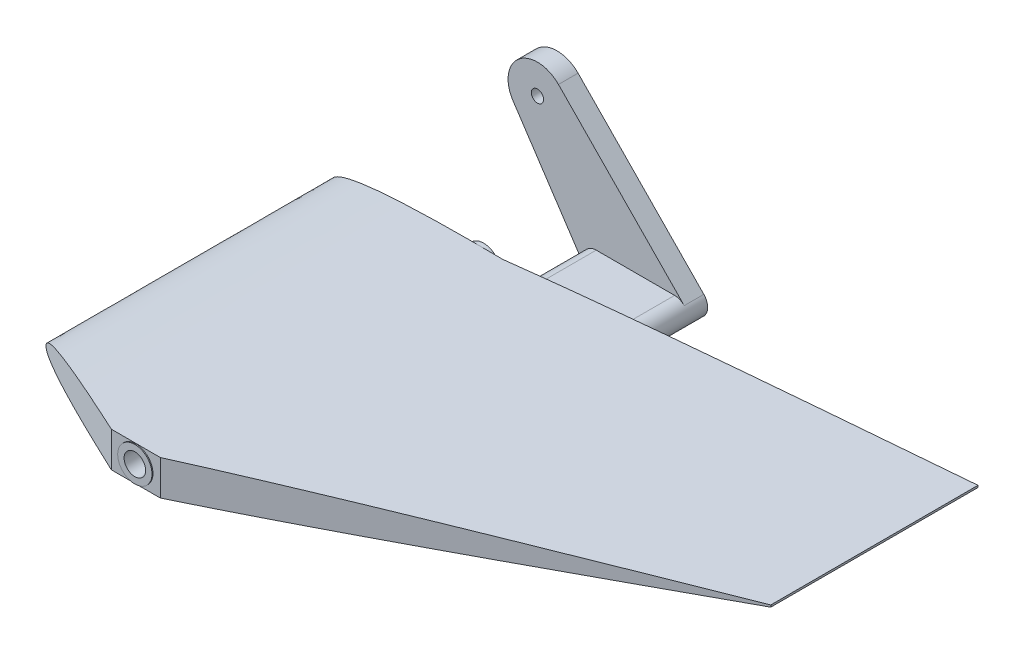
ISO-10303-21;
HEADER;
FILE_DESCRIPTION(('STEP AP214'),'2;1');
FILE_NAME('part.step','',(''),(''),'','','');
FILE_SCHEMA(('AUTOMOTIVE_DESIGN { 1 0 10303 214 1 1 1 1 }'));
ENDSEC;
DATA;
#1=APPLICATION_CONTEXT('core data for automotive mechanical design processes');
#2=APPLICATION_PROTOCOL_DEFINITION('international standard','automotive_design',2000,#1);
#3=PRODUCT_CONTEXT('',#1,'mechanical');
#4=PRODUCT('Part','Part','',(#3));
#5=PRODUCT_RELATED_PRODUCT_CATEGORY('part','',(#4));
#6=PRODUCT_DEFINITION_FORMATION('','',#4);
#7=PRODUCT_DEFINITION_CONTEXT('part definition',#1,'design');
#8=PRODUCT_DEFINITION('design','',#6,#7);
#9=PRODUCT_DEFINITION_SHAPE('','',#8);
#10=(LENGTH_UNIT() NAMED_UNIT(*) SI_UNIT(.MILLI.,.METRE.));
#11=(NAMED_UNIT(*) PLANE_ANGLE_UNIT() SI_UNIT($,.RADIAN.));
#12=(NAMED_UNIT(*) SI_UNIT($,.STERADIAN.) SOLID_ANGLE_UNIT());
#13=UNCERTAINTY_MEASURE_WITH_UNIT(LENGTH_MEASURE(1.E-05),#10,'distance_accuracy_value','');
#14=(GEOMETRIC_REPRESENTATION_CONTEXT(3) GLOBAL_UNCERTAINTY_ASSIGNED_CONTEXT((#13)) GLOBAL_UNIT_ASSIGNED_CONTEXT((#10,
#11,#12)) REPRESENTATION_CONTEXT('',''));
#15=CARTESIAN_POINT('',(0.,0.,0.));
#16=DIRECTION('',(0.,0.,1.));
#17=DIRECTION('',(1.,0.,0.));
#18=AXIS2_PLACEMENT_3D('',#15,#16,#17);
#19=CARTESIAN_POINT('',(-2.5,-1.96626552457139,15.));
#20=DIRECTION('',(0.,0.,1.));
#21=DIRECTION('',(1.,0.,0.));
#22=AXIS2_PLACEMENT_3D('',#19,#20,#21);
#23=PLANE('',#22);
#24=CARTESIAN_POINT('',(-15.,0.,15.));
#25=CARTESIAN_POINT('',(-15.,3.23099592693577,15.));
#26=CARTESIAN_POINT('',(19.0770662568638,1.403070244414,15.));
#27=CARTESIAN_POINT('',(44.9999166666089,0.100000000000006,15.));
#28=B_SPLINE_CURVE_WITH_KNOTS('',3,(#24,#25,#26,#27),.UNSPECIFIED.,.F.,.F.,(4,4),(0.,1.),.UNSPECIFIED.);
#29=CARTESIAN_POINT('',(-15.,0.,15.));
#30=VERTEX_POINT('',#29);
#31=CARTESIAN_POINT('',(2.5,1.79110454395852,15.));
#32=VERTEX_POINT('',#31);
#33=EDGE_CURVE('E220',#30,#32,#28,.T.);
#34=ORIENTED_EDGE('',*,*,#33,.T.);
#35=DIRECTION('',(0.,1.,0.));
#36=VECTOR('',#35,1.);
#37=CARTESIAN_POINT('',(2.5,-1.96626552457139,15.));
#38=LINE('',#37,#36);
#39=CARTESIAN_POINT('',(2.49999999900894,-1.79110454395852,15.));
#40=VERTEX_POINT('',#39);
#41=EDGE_CURVE('E215',#40,#32,#38,.T.);
#42=ORIENTED_EDGE('',*,*,#41,.F.);
#43=CARTESIAN_POINT('',(-15.,0.,15.));
#44=CARTESIAN_POINT('',(-15.,-3.23099592693578,15.));
#45=CARTESIAN_POINT('',(19.0770662568638,-1.40307024441399,15.));
#46=CARTESIAN_POINT('',(44.9999166666089,-0.0999999999999841,15.));
#47=B_SPLINE_CURVE_WITH_KNOTS('',3,(#43,#44,#45,#46),.UNSPECIFIED.,.F.,.F.,(4,4),(0.,1.),.UNSPECIFIED.);
#48=EDGE_CURVE('E261',#30,#40,#47,.T.);
#49=ORIENTED_EDGE('',*,*,#48,.F.);
#50=EDGE_LOOP('',(#34,#42,#49));
#51=FACE_BOUND('',#50,.T.);
#52=CARTESIAN_POINT('',(0.,0.,15.));
#53=DIRECTION('',(0.,0.,1.));
#54=DIRECTION('',(1.,0.,0.));
#55=AXIS2_PLACEMENT_3D('',#52,#53,#54);
#56=CIRCLE('',#55,1.75);
#57=CARTESIAN_POINT('',(1.75,0.,15.));
#58=VERTEX_POINT('',#57);
#59=EDGE_CURVE('E11',#58,#58,#56,.F.);
#60=ORIENTED_EDGE('',*,*,#59,.F.);
#61=EDGE_LOOP('',(#60));
#62=FACE_BOUND('',#61,.T.);
#63=ADVANCED_FACE('F32',(#51,#62),#23,.F.);
#64=CARTESIAN_POINT('',(5.27888942965003,1.75027481425616,50.));
#65=DIRECTION('',(0.,0.,1.));
#66=DIRECTION('',(1.,0.,0.));
#67=AXIS2_PLACEMENT_3D('',#64,#65,#66);
#68=PLANE('',#67);
#69=DIRECTION('',(0.,1.,0.));
#70=VECTOR('',#69,1.);
#71=CARTESIAN_POINT('',(-2.5,-1.96626552457139,50.));
#72=LINE('',#71,#70);
#73=CARTESIAN_POINT('',(-2.5,-1.79873151539779,50.));
#74=VERTEX_POINT('',#73);
#75=CARTESIAN_POINT('',(-2.5,1.79873151539779,50.));
#76=VERTEX_POINT('',#75);
#77=EDGE_CURVE('E237',#74,#76,#72,.T.);
#78=ORIENTED_EDGE('',*,*,#77,.F.);
#79=CARTESIAN_POINT('',(-15.,0.,50.));
#80=CARTESIAN_POINT('',(-15.,-3.23099592693578,50.));
#81=CARTESIAN_POINT('',(19.0770662568638,-1.40307024441399,50.));
#82=CARTESIAN_POINT('',(44.9999166666089,-0.0999999999999841,50.));
#83=B_SPLINE_CURVE_WITH_KNOTS('',3,(#79,#80,#81,#82),.UNSPECIFIED.,.F.,.F.,(4,4),(0.,1.),.UNSPECIFIED.);
#84=CARTESIAN_POINT('',(2.49999999897597,-1.79110454395887,50.));
#85=VERTEX_POINT('',#84);
#86=EDGE_CURVE('E277',#74,#85,#83,.T.);
#87=ORIENTED_EDGE('',*,*,#86,.T.);
#88=DIRECTION('',(0.,1.,0.));
#89=VECTOR('',#88,1.);
#90=CARTESIAN_POINT('',(2.5,-1.96626552457139,50.));
#91=LINE('',#90,#89);
#92=CARTESIAN_POINT('',(2.5,1.79110454395852,50.));
#93=VERTEX_POINT('',#92);
#94=EDGE_CURVE('E236',#85,#93,#91,.T.);
#95=ORIENTED_EDGE('',*,*,#94,.T.);
#96=CARTESIAN_POINT('',(-15.,0.,50.));
#97=CARTESIAN_POINT('',(-15.,3.23099592693577,50.));
#98=CARTESIAN_POINT('',(19.0770662568638,1.403070244414,50.));
#99=CARTESIAN_POINT('',(44.9999166666089,0.100000000000006,50.));
#100=B_SPLINE_CURVE_WITH_KNOTS('',3,(#96,#97,#98,#99),.UNSPECIFIED.,.F.,.F.,(4,4),(0.,1.),.UNSPECIFIED.);
#101=EDGE_CURVE('E294',#76,#93,#100,.T.);
#102=ORIENTED_EDGE('',*,*,#101,.F.);
#103=EDGE_LOOP('',(#78,#87,#95,#102));
#104=FACE_BOUND('',#103,.T.);
#105=CARTESIAN_POINT('',(0.,0.,50.));
#106=DIRECTION('',(0.,0.,1.));
#107=DIRECTION('',(1.,0.,0.));
#108=AXIS2_PLACEMENT_3D('',#105,#106,#107);
#109=CIRCLE('',#108,1.75);
#110=CARTESIAN_POINT('',(1.75,0.,50.));
#111=VERTEX_POINT('',#110);
#112=EDGE_CURVE('E211',#111,#111,#109,.T.);
#113=ORIENTED_EDGE('',*,*,#112,.F.);
#114=EDGE_LOOP('',(#113));
#115=FACE_BOUND('',#114,.T.);
#116=ADVANCED_FACE('F273',(#104,#115),#68,.T.);
#117=CARTESIAN_POINT('',(44.9999166666088,0.,50.));
#118=DIRECTION('',(-1.,0.,0.));
#119=DIRECTION('',(0.,0.,1.));
#120=AXIS2_PLACEMENT_3D('',#117,#118,#119);
#121=PLANE('',#120);
#122=DIRECTION('',(0.,0.,-1.));
#123=VECTOR('',#122,1.);
#124=CARTESIAN_POINT('',(44.9999166666089,-0.0999999999999841,50.));
#125=LINE('',#124,#123);
#126=CARTESIAN_POINT('',(44.9999166666089,-0.0999999999999841,30.1819633874109));
#127=VERTEX_POINT('',#126);
#128=CARTESIAN_POINT('',(44.9999166666089,-0.0999999999999841,9.027026236893));
#129=VERTEX_POINT('',#128);
#130=EDGE_CURVE('E284',#127,#129,#125,.T.);
#131=ORIENTED_EDGE('',*,*,#130,.T.);
#132=DIRECTION('',(0.,1.,0.));
#133=VECTOR('',#132,1.);
#134=CARTESIAN_POINT('',(44.9999166666088,0.,9.02702623689302));
#135=LINE('',#134,#133);
#136=CARTESIAN_POINT('',(44.9999166666088,0.100000000000006,9.02702623689302));
#137=VERTEX_POINT('',#136);
#138=EDGE_CURVE('E224',#129,#137,#135,.T.);
#139=ORIENTED_EDGE('',*,*,#138,.T.);
#140=DIRECTION('',(0.,0.,-1.));
#141=VECTOR('',#140,1.);
#142=CARTESIAN_POINT('',(44.9999166666089,0.100000000000006,50.));
#143=LINE('',#142,#141);
#144=CARTESIAN_POINT('',(44.9999166666088,0.100000000000006,30.181963387411));
#145=VERTEX_POINT('',#144);
#146=EDGE_CURVE('E306',#145,#137,#143,.T.);
#147=ORIENTED_EDGE('',*,*,#146,.F.);
#148=DIRECTION('',(0.,-1.,0.));
#149=VECTOR('',#148,1.);
#150=CARTESIAN_POINT('',(44.9999166666088,0.,30.181963387411));
#151=LINE('',#150,#149);
#152=EDGE_CURVE('E431',#145,#127,#151,.T.);
#153=ORIENTED_EDGE('',*,*,#152,.T.);
#154=EDGE_LOOP('',(#131,#139,#147,#153));
#155=FACE_BOUND('',#154,.T.);
#156=ADVANCED_FACE('F34',(#155),#121,.F.);
#157=DIRECTION('',(0.,0.,-1.));
#158=VECTOR('',#157,1.);
#159=SURFACE_OF_LINEAR_EXTRUSION('',#100,#158);
#160=CARTESIAN_POINT('',(2.49999999999999,1.7911045439479,15.));
#161=CARTESIAN_POINT('',(2.94299579855159,1.78635267424155,14.9377410007019));
#162=CARTESIAN_POINT('',(3.38598117579314,1.78069828541525,14.8754834660234));
#163=CARTESIAN_POINT('',(4.27192745899822,1.76776375571893,14.7509718358803));
#164=CARTESIAN_POINT('',(4.71488836502989,1.76048361963034,14.6887177404061));
#165=CARTESIAN_POINT('',(6.04368429824583,1.73647434461113,14.5019676508028));
#166=CARTESIAN_POINT('',(6.92948108974018,1.71757577885995,14.3774770303495));
#167=CARTESIAN_POINT('',(8.70094356229643,1.6750679631911,14.1285142158125));
#168=CARTESIAN_POINT('',(9.5866092456362,1.65145880798633,14.0040420214087));
#169=CARTESIAN_POINT('',(11.3578267455314,1.60033175807395,13.7551136355339));
#170=CARTESIAN_POINT('',(12.2433785623941,1.57281387414023,13.6306574440198));
#171=CARTESIAN_POINT('',(14.0143110058578,1.51450090959102,13.3817691202139));
#172=CARTESIAN_POINT('',(14.8996916402329,1.48370606806087,13.2573369868295));
#173=CARTESIAN_POINT('',(16.6703624407205,1.41934297357888,13.0084854345458));
#174=CARTESIAN_POINT('',(17.5556526058426,1.38577469296889,12.8840660157858));
#175=CARTESIAN_POINT('',(19.3261482209496,1.31628286701933,12.6352390842017));
#176=CARTESIAN_POINT('',(20.2113536702905,1.28035930501083,12.5108315714682));
#177=CARTESIAN_POINT('',(21.9816831062746,1.20651125141132,12.2620279948368));
#178=CARTESIAN_POINT('',(22.8668070928595,1.16858675840047,12.1376319309471));
#179=CARTESIAN_POINT('',(24.6373891638133,1.09102641281829,11.8887928487862));
#180=CARTESIAN_POINT('',(25.5228472146365,1.05138978126176,11.7643498352295));
#181=CARTESIAN_POINT('',(27.293695305898,0.97069538162099,11.5154733663525));
#182=CARTESIAN_POINT('',(28.1790853466496,0.92963762053659,11.3910399109881));
#183=CARTESIAN_POINT('',(29.9498094008223,0.846350598441158,11.1421808743871));
#184=CARTESIAN_POINT('',(30.8351434143586,0.80412133992343,11.0177552931343));
#185=CARTESIAN_POINT('',(32.605766665088,0.718725360707533,10.7689104235333));
#186=CARTESIAN_POINT('',(33.4910559022991,0.675558640389358,10.6444911351826));
#187=CARTESIAN_POINT('',(35.2616654709427,0.588510229476522,10.3956481884734));
#188=CARTESIAN_POINT('',(36.1469857998332,0.544628486244644,10.2712245304722));
#189=CARTESIAN_POINT('',(37.9176034032698,0.456378321402104,10.0223804545465));
#190=CARTESIAN_POINT('',(38.8029006777951,0.412009899367418,9.89796003662492));
#191=CARTESIAN_POINT('',(40.5734832654907,0.323016223055397,9.64912088184067));
#192=CARTESIAN_POINT('',(41.4587685786507,0.278390968569554,9.5247021449794));
#193=CARTESIAN_POINT('',(43.2293394452683,0.18913586645454,9.27586463748525));
#194=CARTESIAN_POINT('',(44.1146249987257,0.144506018822963,9.15144586685238));
#195=CARTESIAN_POINT('',(44.9999166666089,0.100000000000006,9.027026236893));
#196=B_SPLINE_CURVE_WITH_KNOTS('',3,(#160,#161,#162,#163,#164,#165,#166,#167,#168,#169,#170,
#171,#172,#173,#174,#175,#176,#177,#178,#179,#180,#181,#182,#183,#184,#185,#186,#187,#188,#189,
#190,#191,#192,#193,#194,#195),.UNSPECIFIED.,.F.,.F.,(4,2,2,2,2,2,2,2,2,2,2,2,2,2,2,2,2,4),(0.,
1.34212144374541,2.68423894027807,5.36832684792177,8.05236079370445,10.7363873414423,
13.4202181978991,16.1040758221215,18.7879524427429,21.4718309678311,24.1569437322115,
26.8420432728096,29.5271370991374,32.2122298371015,34.8975211423197,37.5828147873192,
40.2681106126732,42.953407851464),.UNSPECIFIED.);
#197=EDGE_CURVE('E230',#32,#137,#196,.T.);
#198=ORIENTED_EDGE('',*,*,#197,.F.);
#199=ORIENTED_EDGE('',*,*,#33,.F.);
#200=DIRECTION('',(0.,0.,-1.));
#201=VECTOR('',#200,1.);
#202=CARTESIAN_POINT('',(-15.,0.,50.));
#203=LINE('',#202,#201);
#204=CARTESIAN_POINT('',(-15.,0.,44.1711542730625));
#205=VERTEX_POINT('',#204);
#206=EDGE_CURVE('E300',#205,#30,#203,.T.);
#207=ORIENTED_EDGE('',*,*,#206,.F.);
#208=CARTESIAN_POINT('',(-2.5000000004362,1.79873151545333,49.9999999999083));
#209=CARTESIAN_POINT('',(-2.84515491322294,1.79546444971144,49.8390516207544));
#210=CARTESIAN_POINT('',(-3.19030425147759,1.79128047791813,49.6781058410898));
#211=CARTESIAN_POINT('',(-3.8805847312388,1.78076039971026,49.3562227670807));
#212=CARTESIAN_POINT('',(-4.22571587203465,1.7744242370886,49.1952854730677));
#213=CARTESIAN_POINT('',(-4.91601959597944,1.75927973349909,48.8733915601451));
#214=CARTESIAN_POINT('',(-5.26119216850366,1.75047078603802,48.7124349461899));
#215=CARTESIAN_POINT('',(-5.95146253084114,1.72994671979295,48.390556590033));
#216=CARTESIAN_POINT('',(-6.29656032140354,1.71823163160998,48.2296348474819));
#217=CARTESIAN_POINT('',(-7.10552456244788,1.68672521632243,47.8524086267099));
#218=CARTESIAN_POINT('',(-7.56934902752301,1.66554197444838,47.6361237266055));
#219=CARTESIAN_POINT('',(-8.26479798707314,1.62761507467177,47.3118305509112));
#220=CARTESIAN_POINT('',(-8.49656083696065,1.61394783381314,47.2037577591329));
#221=CARTESIAN_POINT('',(-8.9599584417045,1.58419750997756,46.9876719072702));
#222=CARTESIAN_POINT('',(-9.1915931975437,1.56811444580258,46.8796588467275));
#223=CARTESIAN_POINT('',(-9.73545600741656,1.52697295832361,46.6260514534981));
#224=CARTESIAN_POINT('',(-10.0476123715414,1.50074066323682,46.4804905503648));
#225=CARTESIAN_POINT('',(-10.6714141885367,1.44148239591281,46.1896069859289));
#226=CARTESIAN_POINT('',(-10.9830596390394,1.40845639227933,46.0442843257303));
#227=CARTESIAN_POINT('',(-11.5050260467172,1.34511592780276,45.8008873925305));
#228=CARTESIAN_POINT('',(-11.7156007857884,1.31736382435564,45.7026947790876));
#229=CARTESIAN_POINT('',(-12.136066618857,1.2561678408189,45.5066283411352));
#230=CARTESIAN_POINT('',(-12.3459577830276,1.22272456502063,45.4087544839034));
#231=CARTESIAN_POINT('',(-12.6979466481651,1.15983938787114,45.2446193805045));
#232=CARTESIAN_POINT('',(-12.8403532114247,1.13251338436539,45.178214109485));
#233=CARTESIAN_POINT('',(-13.1243839136272,1.07304659107225,45.0457684178968));
#234=CARTESIAN_POINT('',(-13.2660079175113,1.04090499553157,44.9797280603071));
#235=CARTESIAN_POINT('',(-13.503931842671,0.981027670155204,44.8687823119469));
#236=CARTESIAN_POINT('',(-13.6005921474296,0.955044095776345,44.8237088715983));
#237=CARTESIAN_POINT('',(-13.7928763130635,0.898974348051597,44.7340452926213));
#238=CARTESIAN_POINT('',(-13.8885008983038,0.868891272792251,44.6894548162159));
#239=CARTESIAN_POINT('',(-14.0494000827992,0.813038693947245,44.6144262942947));
#240=CARTESIAN_POINT('',(-14.1150880805001,0.788725814487778,44.5837954779179));
#241=CARTESIAN_POINT('',(-14.2454364305391,0.736462795311037,44.5230130440669));
#242=CARTESIAN_POINT('',(-14.3100945807146,0.708505797889061,44.4928624534779));
#243=CARTESIAN_POINT('',(-14.4079896297293,0.661773492818289,44.4472132424269));
#244=CARTESIAN_POINT('',(-14.4419094032226,0.644742795960359,44.4313961922841));
#245=CARTESIAN_POINT('',(-14.5089935460627,0.608965819875951,44.400114342737));
#246=CARTESIAN_POINT('',(-14.5421581239068,0.590220021512818,44.3846494461088));
#247=CARTESIAN_POINT('',(-14.6073539391702,0.550674702175321,44.3542481381718));
#248=CARTESIAN_POINT('',(-14.6393881133792,0.529881132061422,44.3393103574155));
#249=CARTESIAN_POINT('',(-14.7019281835817,0.485687150431328,44.3101474437385));
#250=CARTESIAN_POINT('',(-14.7324355853007,0.462289383703129,44.2959216086865));
#251=CARTESIAN_POINT('',(-14.7857121781122,0.416816100397387,44.2710783254581));
#252=CARTESIAN_POINT('',(-14.8088679267476,0.395298604306648,44.2602806225392));
#253=CARTESIAN_POINT('',(-14.8529799547397,0.349554011757961,44.2397108460697));
#254=CARTESIAN_POINT('',(-14.8739329518419,0.325322979854669,44.2299403030596));
#255=CARTESIAN_POINT('',(-14.9128071651853,0.273306292004445,44.2118129596728));
#256=CARTESIAN_POINT('',(-14.9306727627901,0.245468663237339,44.2034820946922));
#257=CARTESIAN_POINT('',(-14.9611286892651,0.18655205842536,44.1892802629407));
#258=CARTESIAN_POINT('',(-14.9737507532035,0.155494046792322,44.1833944978645));
#259=CARTESIAN_POINT('',(-14.988485062429,0.103419653037316,44.176523776635));
#260=CARTESIAN_POINT('',(-14.99277291021,0.0831448335721506,44.1745243203777));
#261=CARTESIAN_POINT('',(-14.9985643505244,0.0419250654233688,44.1718237274074));
#262=CARTESIAN_POINT('',(-15.000041501236,0.020975620037573,44.1711349207184));
#263=CARTESIAN_POINT('',(-15.,0.,44.1711542730625));
#264=B_SPLINE_CURVE_WITH_KNOTS('',3,(#208,#209,#210,#211,#212,#213,#214,#215,#216,#217,#218,
#219,#220,#221,#222,#223,#224,#225,#226,#227,#228,#229,#230,#231,#232,#233,#234,#235,#236,#237,
#238,#239,#240,#241,#242,#243,#244,#245,#246,#247,#248,#249,#250,#251,#252,#253,#254,#255,#256,
#257,#258,#259,#260,#261,#262,#263),.UNSPECIFIED.,.F.,.F.,(4,2,2,2,2,2,2,2,2,2,2,2,2,2,2,2,2,2,
2,2,2,2,2,2,2,2,2,4),(0.,1.14255232233199,2.28513448611623,3.42799713314855,4.5708477465908,
6.10742476928897,6.87567670550753,7.64392266285183,8.68014812168788,9.7163783694152,
10.4183174070165,11.1201819588534,11.5985929535045,12.0770840863039,12.4063473299151,
12.7353631076222,12.9646459961354,13.1943667653768,13.3176908077183,13.4409803790147,
13.5639216863358,13.6867392561384,13.7868046537219,13.8870171031977,13.9888800914784,
14.0901172694087,14.152348844648,14.2151630277025),.UNSPECIFIED.);
#265=EDGE_CURVE('E285',#76,#205,#264,.T.);
#266=ORIENTED_EDGE('',*,*,#265,.F.);
#267=ORIENTED_EDGE('',*,*,#101,.T.);
#268=CARTESIAN_POINT('',(44.9999166666089,0.100000000000006,30.1819633874109));
#269=CARTESIAN_POINT('',(44.1148539520676,0.144494505529035,30.594674909149));
#270=CARTESIAN_POINT('',(43.2297963586757,0.189112829893827,31.0073840428559));
#271=CARTESIAN_POINT('',(41.4596813791523,0.278344955505571,31.8328022136225));
#272=CARTESIAN_POINT('',(40.5746239930207,0.322958756754525,32.2455112506823));
#273=CARTESIAN_POINT('',(38.8044992099027,0.411929685004527,33.0709339929402));
#274=CARTESIAN_POINT('',(37.9194318129235,0.456286812180722,33.4836476981349));
#275=CARTESIAN_POINT('',(36.1492777185011,0.54451463119046,34.3090841084785));
#276=CARTESIAN_POINT('',(35.2641910210724,0.588385323379482,34.7218068136206));
#277=CARTESIAN_POINT('',(33.4940436627264,0.675412493871967,35.5472400828802));
#278=CARTESIAN_POINT('',(32.6089830035915,0.718569016242302,35.9599506461665));
#279=CARTESIAN_POINT('',(30.838824195479,0.803945036408509,36.7853892545399));
#280=CARTESIAN_POINT('',(29.9537260464886,0.846164533885258,37.1981172996329));
#281=CARTESIAN_POINT('',(28.1834828393485,0.929432616607342,38.0235952639192));
#282=CARTESIAN_POINT('',(27.2983377811179,0.970481199763388,38.4363451831502));
#283=CARTESIAN_POINT('',(25.5279907251362,1.05115801918676,39.2618715729467));
#284=CARTESIAN_POINT('',(24.6427887271653,1.09078624959195,39.6746480436146));
#285=CARTESIAN_POINT('',(22.8721667258692,1.16835559329362,40.5003026425167));
#286=CARTESIAN_POINT('',(21.9867467117123,1.20629640632479,40.9131807758018));
#287=CARTESIAN_POINT('',(20.2158383976516,1.28017582945892,41.7389688845387));
#288=CARTESIAN_POINT('',(19.3303500977886,1.31611444075027,42.1518788599714));
#289=CARTESIAN_POINT('',(17.5593024862227,1.38563492380329,42.9777319242017));
#290=CARTESIAN_POINT('',(16.673743174972,1.41921680954154,43.3906750127884));
#291=CARTESIAN_POINT('',(14.9025487194378,1.48360547982689,44.2165965514857));
#292=CARTESIAN_POINT('',(14.01691357585,1.51441228756536,44.6295750012719));
#293=CARTESIAN_POINT('',(12.2454998028185,1.57274694526465,45.4555988093977));
#294=CARTESIAN_POINT('',(11.3597211679137,1.6002745947326,45.8686441702839));
#295=CARTESIAN_POINT('',(9.5880684633916,1.65141916297327,46.6947793939935));
#296=CARTESIAN_POINT('',(8.70219439355857,1.67503607271203,47.1078692569176));
#297=CARTESIAN_POINT('',(6.93033637435116,1.7175571317118,47.9341002204374));
#298=CARTESIAN_POINT('',(6.04435242337699,1.73646120156521,48.3472413217791));
#299=CARTESIAN_POINT('',(4.7152920668592,1.76047685957017,48.9669923441735));
#300=CARTESIAN_POINT('',(4.27224770376309,1.76775878846156,49.1735873235877));
#301=CARTESIAN_POINT('',(3.38613847128225,1.78069627950454,49.5867868446553));
#302=CARTESIAN_POINT('',(2.94307360184968,1.78635183764834,49.7933913863312));
#303=CARTESIAN_POINT('',(2.50000000000006,1.7911045439479,50.));
#304=B_SPLINE_CURVE_WITH_KNOTS('',3,(#268,#269,#270,#271,#272,#273,#274,#275,#276,#277,#278,
#279,#280,#281,#282,#283,#284,#285,#286,#287,#288,#289,#290,#291,#292,#293,#294,#295,#296,#297,
#298,#299,#300,#301,#302,#303),.UNSPECIFIED.,.F.,.F.,(4,2,2,2,2,2,2,2,2,2,2,2,2,2,2,2,2,4),(0.,
2.93271530907,5.86542931407675,8.79814131765507,11.7308511779199,14.6633793994724,
17.5959086197421,20.5284430722614,23.4609896266502,26.3940559383216,29.3271205090603,
32.260167683742,35.193190344639,38.1263922431945,41.0596009174579,43.9928590106122,
45.4595554048849,46.926255413439),.UNSPECIFIED.);
#305=EDGE_CURVE('E427',#145,#93,#304,.T.);
#306=ORIENTED_EDGE('',*,*,#305,.F.);
#307=ORIENTED_EDGE('',*,*,#146,.T.);
#308=EDGE_LOOP('',(#198,#199,#207,#266,#267,#306,#307));
#309=FACE_BOUND('',#308,.T.);
#310=ADVANCED_FACE('F239',(#309),#159,.T.);
#311=DIRECTION('',(0.,0.,-1.));
#312=VECTOR('',#311,1.);
#313=SURFACE_OF_LINEAR_EXTRUSION('',#83,#312);
#314=ORIENTED_EDGE('',*,*,#48,.T.);
#315=CARTESIAN_POINT('',(2.49999999999999,-1.7911045439479,15.));
#316=CARTESIAN_POINT('',(2.94299579855159,-1.78635267424154,14.9377410007019));
#317=CARTESIAN_POINT('',(3.38598117579314,-1.78069828541524,14.8754834660234));
#318=CARTESIAN_POINT('',(4.27192745899822,-1.76776375571893,14.7509718358803));
#319=CARTESIAN_POINT('',(4.71488836502989,-1.76048361963034,14.6887177404061));
#320=CARTESIAN_POINT('',(6.04368429824583,-1.73647434461113,14.5019676508028));
#321=CARTESIAN_POINT('',(6.92948108974018,-1.71757577885995,14.3774770303495));
#322=CARTESIAN_POINT('',(8.70094356229643,-1.67506796319109,14.1285142158125));
#323=CARTESIAN_POINT('',(9.5866092456362,-1.65145880798632,14.0040420214087));
#324=CARTESIAN_POINT('',(11.3578267455314,-1.60033175807394,13.7551136355339));
#325=CARTESIAN_POINT('',(12.243378562394,-1.57281387414023,13.6306574440198));
#326=CARTESIAN_POINT('',(14.0143110058578,-1.51450090959101,13.3817691202139));
#327=CARTESIAN_POINT('',(14.8996916402329,-1.48370606806086,13.2573369868295));
#328=CARTESIAN_POINT('',(16.6703624407205,-1.41934297357888,13.0084854345458));
#329=CARTESIAN_POINT('',(17.5556526058426,-1.38577469296889,12.8840660157858));
#330=CARTESIAN_POINT('',(19.3261482209496,-1.31628286701932,12.6352390842017));
#331=CARTESIAN_POINT('',(20.2113536702905,-1.28035930501082,12.5108315714682));
#332=CARTESIAN_POINT('',(21.9816831062745,-1.2065112514113,12.2620279948368));
#333=CARTESIAN_POINT('',(22.8668070928595,-1.16858675840046,12.1376319309471));
#334=CARTESIAN_POINT('',(24.6373891638132,-1.09102641281828,11.8887928487862));
#335=CARTESIAN_POINT('',(25.5228472146365,-1.05138978126175,11.7643498352295));
#336=CARTESIAN_POINT('',(27.293695305898,-0.970695381620977,11.5154733663525));
#337=CARTESIAN_POINT('',(28.1790853466496,-0.929637620536576,11.3910399109881));
#338=CARTESIAN_POINT('',(29.9498094008223,-0.846350598441144,11.1421808743871));
#339=CARTESIAN_POINT('',(30.8351434143586,-0.804121339923416,11.0177552931343));
#340=CARTESIAN_POINT('',(32.605766665088,-0.718725360707518,10.7689104235333));
#341=CARTESIAN_POINT('',(33.4910559022991,-0.675558640389342,10.6444911351826));
#342=CARTESIAN_POINT('',(35.2616654709427,-0.588510229476505,10.3956481884734));
#343=CARTESIAN_POINT('',(36.1469857998332,-0.544628486244626,10.2712245304722));
#344=CARTESIAN_POINT('',(37.9176034032698,-0.456378321402086,10.0223804545465));
#345=CARTESIAN_POINT('',(38.8029006777951,-0.412009899367399,9.89796003662492));
#346=CARTESIAN_POINT('',(40.5734832654907,-0.323016223055377,9.64912088184067));
#347=CARTESIAN_POINT('',(41.4587685786507,-0.278390968569533,9.5247021449794));
#348=CARTESIAN_POINT('',(43.2293394452683,-0.189135866454519,9.27586463748524));
#349=CARTESIAN_POINT('',(44.1146249987257,-0.144506018822942,9.15144586685238));
#350=CARTESIAN_POINT('',(44.9999166666089,-0.0999999999999841,9.027026236893));
#351=B_SPLINE_CURVE_WITH_KNOTS('',3,(#315,#316,#317,#318,#319,#320,#321,#322,#323,#324,#325,
#326,#327,#328,#329,#330,#331,#332,#333,#334,#335,#336,#337,#338,#339,#340,#341,#342,#343,#344,
#345,#346,#347,#348,#349,#350),.UNSPECIFIED.,.F.,.F.,(4,2,2,2,2,2,2,2,2,2,2,2,2,2,2,2,2,4),(0.,
1.34212144374541,2.68423894027807,5.36832684792177,8.05236079370444,10.7363873414423,
13.4202181978991,16.1040758221215,18.7879524427429,21.4718309678311,24.1569437322115,
26.8420432728096,29.5271370991374,32.2122298371015,34.8975211423197,37.5828147873192,
40.2681106126732,42.953407851464),.UNSPECIFIED.);
#352=EDGE_CURVE('E41',#40,#129,#351,.T.);
#353=ORIENTED_EDGE('',*,*,#352,.T.);
#354=ORIENTED_EDGE('',*,*,#130,.F.);
#355=CARTESIAN_POINT('',(44.9999166666089,-0.0999999999999841,30.1819633874109));
#356=CARTESIAN_POINT('',(44.1148539520676,-0.144494505529013,30.594674909149));
#357=CARTESIAN_POINT('',(43.2297963586757,-0.189112829893806,31.0073840428559));
#358=CARTESIAN_POINT('',(41.4596813791523,-0.27834495550555,31.8328022136225));
#359=CARTESIAN_POINT('',(40.5746239930207,-0.322958756754505,32.2455112506823));
#360=CARTESIAN_POINT('',(38.8044992099027,-0.411929685004508,33.0709339929402));
#361=CARTESIAN_POINT('',(37.9194318129235,-0.456286812180703,33.4836476981349));
#362=CARTESIAN_POINT('',(36.1492777185011,-0.544514631190443,34.3090841084785));
#363=CARTESIAN_POINT('',(35.2641910210724,-0.588385323379465,34.7218068136206));
#364=CARTESIAN_POINT('',(33.4940436627264,-0.675412493871951,35.5472400828802));
#365=CARTESIAN_POINT('',(32.6089830035915,-0.718569016242286,35.9599506461665));
#366=CARTESIAN_POINT('',(30.838824195479,-0.803945036408494,36.7853892545399));
#367=CARTESIAN_POINT('',(29.9537260464886,-0.846164533885243,37.1981172996329));
#368=CARTESIAN_POINT('',(28.1834828393485,-0.929432616607328,38.0235952639192));
#369=CARTESIAN_POINT('',(27.2983377811179,-0.970481199763375,38.4363451831502));
#370=CARTESIAN_POINT('',(25.5279907251362,-1.05115801918675,39.2618715729467));
#371=CARTESIAN_POINT('',(24.6427887271653,-1.09078624959194,39.6746480436146));
#372=CARTESIAN_POINT('',(22.8721667258692,-1.16835559329361,40.5003026425167));
#373=CARTESIAN_POINT('',(21.9867467117123,-1.20629640632478,40.9131807758018));
#374=CARTESIAN_POINT('',(20.2158383976516,-1.28017582945891,41.7389688845387));
#375=CARTESIAN_POINT('',(19.3303500977886,-1.31611444075027,42.1518788599714));
#376=CARTESIAN_POINT('',(17.5593024862227,-1.38563492380328,42.9777319242017));
#377=CARTESIAN_POINT('',(16.673743174972,-1.41921680954153,43.3906750127884));
#378=CARTESIAN_POINT('',(14.9025487194378,-1.48360547982689,44.2165965514857));
#379=CARTESIAN_POINT('',(14.01691357585,-1.51441228756535,44.6295750012719));
#380=CARTESIAN_POINT('',(12.2454998028185,-1.57274694526464,45.4555988093977));
#381=CARTESIAN_POINT('',(11.3597211679137,-1.60027459473259,45.8686441702839));
#382=CARTESIAN_POINT('',(9.5880684633916,-1.65141916297326,46.6947793939935));
#383=CARTESIAN_POINT('',(8.70219439355857,-1.67503607271203,47.1078692569176));
#384=CARTESIAN_POINT('',(6.93033637435116,-1.7175571317118,47.9341002204374));
#385=CARTESIAN_POINT('',(6.04435242337699,-1.7364612015652,48.3472413217791));
#386=CARTESIAN_POINT('',(4.7152920668592,-1.76047685957017,48.9669923441735));
#387=CARTESIAN_POINT('',(4.27224770376309,-1.76775878846156,49.1735873235877));
#388=CARTESIAN_POINT('',(3.38613847128224,-1.78069627950454,49.5867868446553));
#389=CARTESIAN_POINT('',(2.94307360184968,-1.78635183764834,49.7933913863312));
#390=CARTESIAN_POINT('',(2.50000000000006,-1.7911045439479,50.));
#391=B_SPLINE_CURVE_WITH_KNOTS('',3,(#355,#356,#357,#358,#359,#360,#361,#362,#363,#364,#365,
#366,#367,#368,#369,#370,#371,#372,#373,#374,#375,#376,#377,#378,#379,#380,#381,#382,#383,#384,
#385,#386,#387,#388,#389,#390),.UNSPECIFIED.,.F.,.F.,(4,2,2,2,2,2,2,2,2,2,2,2,2,2,2,2,2,4),(0.,
2.93271530907,5.86542931407675,8.79814131765507,11.7308511779199,14.6633793994724,
17.5959086197421,20.5284430722614,23.4609896266502,26.3940559383216,29.3271205090603,
32.260167683742,35.193190344639,38.1263922431945,41.0596009174579,43.9928590106122,
45.4595554048849,46.926255413439),.UNSPECIFIED.);
#392=EDGE_CURVE('E308',#127,#85,#391,.T.);
#393=ORIENTED_EDGE('',*,*,#392,.T.);
#394=ORIENTED_EDGE('',*,*,#86,.F.);
#395=CARTESIAN_POINT('',(-2.50000000043617,-1.79873151545333,49.9999999999083));
#396=CARTESIAN_POINT('',(-2.84515491322292,-1.79546444971144,49.8390516207544));
#397=CARTESIAN_POINT('',(-3.19030425147757,-1.79128047791813,49.6781058410898));
#398=CARTESIAN_POINT('',(-3.88058473123878,-1.78076039971026,49.3562227670808));
#399=CARTESIAN_POINT('',(-4.22571587203463,-1.7744242370886,49.1952854730677));
#400=CARTESIAN_POINT('',(-4.91601959597942,-1.75927973349909,48.8733915601451));
#401=CARTESIAN_POINT('',(-5.26119216850364,-1.75047078603802,48.7124349461899));
#402=CARTESIAN_POINT('',(-5.95146253084112,-1.72994671979295,48.390556590033));
#403=CARTESIAN_POINT('',(-6.29656032140352,-1.71823163160999,48.2296348474819));
#404=CARTESIAN_POINT('',(-7.10552456244787,-1.68672521632244,47.8524086267099));
#405=CARTESIAN_POINT('',(-7.56934902752299,-1.66554197444838,47.6361237266055));
#406=CARTESIAN_POINT('',(-8.26479798707313,-1.62761507467178,47.3118305509112));
#407=CARTESIAN_POINT('',(-8.49656083696064,-1.61394783381315,47.2037577591329));
#408=CARTESIAN_POINT('',(-8.9599584417045,-1.58419750997756,46.9876719072702));
#409=CARTESIAN_POINT('',(-9.19159319754369,-1.56811444580259,46.8796588467275));
#410=CARTESIAN_POINT('',(-9.73545600741655,-1.52697295832361,46.6260514534981));
#411=CARTESIAN_POINT('',(-10.0476123715414,-1.50074066323683,46.4804905503648));
#412=CARTESIAN_POINT('',(-10.6714141885367,-1.44148239591282,46.1896069859289));
#413=CARTESIAN_POINT('',(-10.9830596390394,-1.40845639227934,46.0442843257303));
#414=CARTESIAN_POINT('',(-11.5050260467172,-1.34511592780277,45.8008873925305));
#415=CARTESIAN_POINT('',(-11.7156007857884,-1.31736382435565,45.7026947790876));
#416=CARTESIAN_POINT('',(-12.136066618857,-1.25616784081891,45.5066283411352));
#417=CARTESIAN_POINT('',(-12.3459577830276,-1.22272456502064,45.4087544839034));
#418=CARTESIAN_POINT('',(-12.6979466481651,-1.15983938787115,45.2446193805045));
#419=CARTESIAN_POINT('',(-12.8403532114247,-1.1325133843654,45.178214109485));
#420=CARTESIAN_POINT('',(-13.1243839136272,-1.07304659107226,45.0457684178968));
#421=CARTESIAN_POINT('',(-13.2660079175113,-1.04090499553157,44.9797280603071));
#422=CARTESIAN_POINT('',(-13.503931842671,-0.981027670155211,44.8687823119469));
#423=CARTESIAN_POINT('',(-13.6005921474296,-0.95504409577635,44.8237088715983));
#424=CARTESIAN_POINT('',(-13.7928763130635,-0.898974348051602,44.7340452926213));
#425=CARTESIAN_POINT('',(-13.8885008983038,-0.868891272792257,44.6894548162159));
#426=CARTESIAN_POINT('',(-14.0494000827992,-0.813038693947253,44.6144262942947));
#427=CARTESIAN_POINT('',(-14.1150880805001,-0.788725814487787,44.5837954779179));
#428=CARTESIAN_POINT('',(-14.2454364305391,-0.736462795311044,44.5230130440669));
#429=CARTESIAN_POINT('',(-14.3100945807146,-0.708505797889066,44.4928624534779));
#430=CARTESIAN_POINT('',(-14.4079896297293,-0.661773492818295,44.4472132424269));
#431=CARTESIAN_POINT('',(-14.4419094032227,-0.644742795960367,44.4313961922841));
#432=CARTESIAN_POINT('',(-14.5089935460627,-0.608965819875959,44.400114342737));
#433=CARTESIAN_POINT('',(-14.5421581239068,-0.590220021512824,44.3846494461088));
#434=CARTESIAN_POINT('',(-14.6073539391702,-0.550674702175325,44.3542481381718));
#435=CARTESIAN_POINT('',(-14.6393881133792,-0.529881132061426,44.3393103574155));
#436=CARTESIAN_POINT('',(-14.7019281835817,-0.485687150431331,44.3101474437385));
#437=CARTESIAN_POINT('',(-14.7324355853007,-0.462289383703132,44.2959216086865));
#438=CARTESIAN_POINT('',(-14.7857121781122,-0.416816100397391,44.2710783254581));
#439=CARTESIAN_POINT('',(-14.8088679267476,-0.395298604306653,44.2602806225391));
#440=CARTESIAN_POINT('',(-14.8529799547397,-0.349554011757966,44.2397108460697));
#441=CARTESIAN_POINT('',(-14.8739329518419,-0.325322979854673,44.2299403030596));
#442=CARTESIAN_POINT('',(-14.9128071651853,-0.273306292004447,44.2118129596728));
#443=CARTESIAN_POINT('',(-14.9306727627901,-0.245468663237341,44.2034820946922));
#444=CARTESIAN_POINT('',(-14.9611286892651,-0.186552058425364,44.1892802629407));
#445=CARTESIAN_POINT('',(-14.9737507532035,-0.155494046792327,44.1833944978645));
#446=CARTESIAN_POINT('',(-14.988485062429,-0.103419653037323,44.176523776635));
#447=CARTESIAN_POINT('',(-14.99277291021,-0.0831448335721569,44.1745243203777));
#448=CARTESIAN_POINT('',(-14.9985643505244,-0.0419250654233751,44.1718237274074));
#449=CARTESIAN_POINT('',(-15.000041501236,-0.0209756200375794,44.1711349207184));
#450=CARTESIAN_POINT('',(-15.,0.,44.1711542730625));
#451=B_SPLINE_CURVE_WITH_KNOTS('',3,(#395,#396,#397,#398,#399,#400,#401,#402,#403,#404,#405,
#406,#407,#408,#409,#410,#411,#412,#413,#414,#415,#416,#417,#418,#419,#420,#421,#422,#423,#424,
#425,#426,#427,#428,#429,#430,#431,#432,#433,#434,#435,#436,#437,#438,#439,#440,#441,#442,#443,
#444,#445,#446,#447,#448,#449,#450),.UNSPECIFIED.,.F.,.F.,(4,2,2,2,2,2,2,2,2,2,2,2,2,2,2,2,2,2,
2,2,2,2,2,2,2,2,2,4),(0.,1.14255232233198,2.28513448611623,3.42799713314856,4.57084774659081,
6.10742476928898,6.87567670550754,7.64392266285184,8.68014812168789,9.71637836941522,
10.4183174070165,11.1201819588535,11.5985929535045,12.0770840863039,12.4063473299151,
12.7353631076222,12.9646459961355,13.1943667653769,13.3176908077184,13.4409803790148,
13.5639216863358,13.6867392561385,13.786804653722,13.8870171031977,13.9888800914785,
14.0901172694087,14.152348844648,14.2151630277025),.UNSPECIFIED.);
#452=EDGE_CURVE('E313',#74,#205,#451,.T.);
#453=ORIENTED_EDGE('',*,*,#452,.T.);
#454=ORIENTED_EDGE('',*,*,#206,.T.);
#455=EDGE_LOOP('',(#314,#353,#354,#393,#394,#453,#454));
#456=FACE_BOUND('',#455,.T.);
#457=ADVANCED_FACE('F265',(#456),#313,.F.);
#458=CARTESIAN_POINT('',(2.5,-1.96626552457139,50.));
#459=DIRECTION('',(-0.422618261740701,0.,-0.906307787036649));
#460=DIRECTION('',(-0.906307787036649,0.,0.422618261740701));
#461=AXIS2_PLACEMENT_3D('',#458,#459,#460);
#462=PLANE('',#461);
#463=ORIENTED_EDGE('',*,*,#305,.T.);
#464=ORIENTED_EDGE('',*,*,#94,.F.);
#465=ORIENTED_EDGE('',*,*,#392,.F.);
#466=ORIENTED_EDGE('',*,*,#152,.F.);
#467=EDGE_LOOP('',(#463,#464,#465,#466));
#468=FACE_BOUND('',#467,.T.);
#469=ADVANCED_FACE('F270',(#468),#462,.F.);
#470=CARTESIAN_POINT('',(-26.5227824566722,-1.96626552457139,38.7979925702622));
#471=DIRECTION('',(0.4226182617407,0.,-0.90630778703665));
#472=DIRECTION('',(-0.90630778703665,0.,-0.4226182617407));
#473=AXIS2_PLACEMENT_3D('',#470,#471,#472);
#474=PLANE('',#473);
#475=ORIENTED_EDGE('',*,*,#265,.T.);
#476=ORIENTED_EDGE('',*,*,#452,.F.);
#477=ORIENTED_EDGE('',*,*,#77,.T.);
#478=EDGE_LOOP('',(#475,#476,#477));
#479=FACE_BOUND('',#478,.T.);
#480=ADVANCED_FACE('F249',(#479),#474,.F.);
#481=CARTESIAN_POINT('',(50.3548634934548,-1.96626552457139,8.2744375400612));
#482=DIRECTION('',(0.139173100960059,0.,0.990268068741571));
#483=DIRECTION('',(0.990268068741571,0.,-0.139173100960059));
#484=AXIS2_PLACEMENT_3D('',#481,#482,#483);
#485=PLANE('',#484);
#486=CARTESIAN_POINT('',(14.,0.,13.3837804009431));
#487=DIRECTION('',(0.139173100960059,0.,0.990268068741571));
#488=DIRECTION('',(0.990268068741571,0.,-0.139173100960059));
#489=AXIS2_PLACEMENT_3D('',#486,#487,#488);
#490=ELLIPSE('',#489,1.3885129122131,1.375);
#491=CARTESIAN_POINT('',(14.,1.375,13.3837804009431));
#492=VERTEX_POINT('',#491);
#493=CARTESIAN_POINT('',(14.,-1.375,13.3837804009226));
#494=VERTEX_POINT('',#493);
#495=EDGE_CURVE('E197',#492,#494,#490,.F.);
#496=ORIENTED_EDGE('',*,*,#495,.F.);
#497=DIRECTION('',(0.990268068741571,0.,-0.139173100960059));
#498=VECTOR('',#497,1.);
#499=CARTESIAN_POINT('',(-68901.33946611,1.37500000000747,9698.80311276626));
#500=LINE('',#499,#498);
#501=CARTESIAN_POINT('',(5.99999999999301,1.375,14.5081070785968));
#502=VERTEX_POINT('',#501);
#503=EDGE_CURVE('E200',#502,#492,#500,.T.);
#504=ORIENTED_EDGE('',*,*,#503,.F.);
#505=CARTESIAN_POINT('',(6.,0.,14.5081070785409));
#506=DIRECTION('',(0.139173100960059,0.,0.990268068741571));
#507=DIRECTION('',(0.990268068741571,0.,-0.139173100960059));
#508=AXIS2_PLACEMENT_3D('',#505,#506,#507);
#509=ELLIPSE('',#508,1.3885129122131,1.375);
#510=CARTESIAN_POINT('',(5.99999999999301,-1.375,14.5081070785968));
#511=VERTEX_POINT('',#510);
#512=EDGE_CURVE('E202',#511,#502,#509,.F.);
#513=ORIENTED_EDGE('',*,*,#512,.F.);
#514=DIRECTION('',(-0.990268068741571,0.,0.139173100960059));
#515=VECTOR('',#514,1.);
#516=CARTESIAN_POINT('',(-68901.33946611,-1.37499999998879,9698.80311276626));
#517=LINE('',#516,#515);
#518=EDGE_CURVE('E190',#494,#511,#517,.T.);
#519=ORIENTED_EDGE('',*,*,#518,.F.);
#520=EDGE_LOOP('',(#496,#504,#513,#519));
#521=FACE_BOUND('',#520,.T.);
#522=ORIENTED_EDGE('',*,*,#197,.T.);
#523=ORIENTED_EDGE('',*,*,#138,.F.);
#524=ORIENTED_EDGE('',*,*,#352,.F.);
#525=ORIENTED_EDGE('',*,*,#41,.T.);
#526=EDGE_LOOP('',(#522,#523,#524,#525));
#527=FACE_BOUND('',#526,.T.);
#528=ADVANCED_FACE('F243',(#521,#527),#485,.F.);
#529=CARTESIAN_POINT('',(0.,0.,50.1));
#530=DIRECTION('',(0.,0.,-1.));
#531=DIRECTION('',(-1.,0.,0.));
#532=AXIS2_PLACEMENT_3D('',#529,#530,#531);
#533=CYLINDRICAL_SURFACE('',#532,1.75);
#534=CARTESIAN_POINT('',(0.,0.,50.1));
#535=DIRECTION('',(0.,0.,1.));
#536=DIRECTION('',(1.,0.,0.));
#537=AXIS2_PLACEMENT_3D('',#534,#535,#536);
#538=CIRCLE('',#537,1.75);
#539=CARTESIAN_POINT('',(1.75,0.,50.1));
#540=VERTEX_POINT('',#539);
#541=EDGE_CURVE('E212',#540,#540,#538,.T.);
#542=ORIENTED_EDGE('',*,*,#541,.F.);
#543=EDGE_LOOP('',(#542));
#544=FACE_BOUND('',#543,.T.);
#545=ORIENTED_EDGE('',*,*,#112,.T.);
#546=EDGE_LOOP('',(#545));
#547=FACE_BOUND('',#546,.T.);
#548=ADVANCED_FACE('F248',(#544,#547),#533,.T.);
#549=CARTESIAN_POINT('',(0.,0.,50.1));
#550=DIRECTION('',(0.,0.,1.));
#551=DIRECTION('',(1.,0.,0.));
#552=AXIS2_PLACEMENT_3D('',#549,#550,#551);
#553=PLANE('',#552);
#554=CARTESIAN_POINT('',(0.,0.,50.1));
#555=DIRECTION('',(0.,0.,1.));
#556=DIRECTION('',(1.,0.,0.));
#557=AXIS2_PLACEMENT_3D('',#554,#555,#556);
#558=CIRCLE('',#557,1.1);
#559=CARTESIAN_POINT('',(1.1,0.,50.1));
#560=VERTEX_POINT('',#559);
#561=EDGE_CURVE('E204',#560,#560,#558,.T.);
#562=ORIENTED_EDGE('',*,*,#561,.F.);
#563=EDGE_LOOP('',(#562));
#564=FACE_BOUND('',#563,.T.);
#565=ORIENTED_EDGE('',*,*,#541,.T.);
#566=EDGE_LOOP('',(#565));
#567=FACE_BOUND('',#566,.T.);
#568=ADVANCED_FACE('F339',(#564,#567),#553,.T.);
#569=CARTESIAN_POINT('',(0.,0.,14.5));
#570=DIRECTION('',(0.,0.,1.));
#571=DIRECTION('',(1.,0.,0.));
#572=AXIS2_PLACEMENT_3D('',#569,#570,#571);
#573=CYLINDRICAL_SURFACE('',#572,1.75);
#574=CARTESIAN_POINT('',(0.,0.,14.5));
#575=DIRECTION('',(0.,0.,-1.));
#576=DIRECTION('',(-1.,0.,0.));
#577=AXIS2_PLACEMENT_3D('',#574,#575,#576);
#578=CIRCLE('',#577,1.75);
#579=CARTESIAN_POINT('',(-1.75,0.,14.5));
#580=VERTEX_POINT('',#579);
#581=EDGE_CURVE('E208',#580,#580,#578,.T.);
#582=ORIENTED_EDGE('',*,*,#581,.F.);
#583=EDGE_LOOP('',(#582));
#584=FACE_BOUND('',#583,.T.);
#585=ORIENTED_EDGE('',*,*,#59,.T.);
#586=EDGE_LOOP('',(#585));
#587=FACE_BOUND('',#586,.T.);
#588=ADVANCED_FACE('F336',(#584,#587),#573,.T.);
#589=CARTESIAN_POINT('',(0.,0.,14.5));
#590=DIRECTION('',(0.,0.,-1.));
#591=DIRECTION('',(-1.,0.,0.));
#592=AXIS2_PLACEMENT_3D('',#589,#590,#591);
#593=PLANE('',#592);
#594=CARTESIAN_POINT('',(0.,0.,14.5));
#595=DIRECTION('',(0.,0.,-1.));
#596=DIRECTION('',(-1.,0.,0.));
#597=AXIS2_PLACEMENT_3D('',#594,#595,#596);
#598=CIRCLE('',#597,1.1);
#599=CARTESIAN_POINT('',(-1.1,0.,14.5));
#600=VERTEX_POINT('',#599);
#601=EDGE_CURVE('E207',#600,#600,#598,.T.);
#602=ORIENTED_EDGE('',*,*,#601,.F.);
#603=EDGE_LOOP('',(#602));
#604=FACE_BOUND('',#603,.T.);
#605=ORIENTED_EDGE('',*,*,#581,.T.);
#606=EDGE_LOOP('',(#605));
#607=FACE_BOUND('',#606,.T.);
#608=ADVANCED_FACE('F338',(#604,#607),#593,.T.);
#609=CARTESIAN_POINT('',(0.,0.,9.027026236893));
#610=DIRECTION('',(0.,0.,1.));
#611=DIRECTION('',(1.,0.,0.));
#612=AXIS2_PLACEMENT_3D('',#609,#610,#611);
#613=CYLINDRICAL_SURFACE('',#612,1.1);
#614=ORIENTED_EDGE('',*,*,#601,.T.);
#615=EDGE_LOOP('',(#614));
#616=FACE_BOUND('',#615,.T.);
#617=ORIENTED_EDGE('',*,*,#561,.T.);
#618=EDGE_LOOP('',(#617));
#619=FACE_BOUND('',#618,.T.);
#620=ADVANCED_FACE('F346',(#616,#619),#613,.F.);
#621=CARTESIAN_POINT('',(6.,1.375,500000.));
#622=DIRECTION('',(0.,1.,0.));
#623=DIRECTION('',(-1.,0.,0.));
#624=AXIS2_PLACEMENT_3D('',#621,#622,#623);
#625=PLANE('',#624);
#626=DIRECTION('',(0.,0.,-1.));
#627=VECTOR('',#626,1.);
#628=CARTESIAN_POINT('',(6.,1.375,500000.));
#629=LINE('',#628,#627);
#630=CARTESIAN_POINT('',(6.,1.375,9.));
#631=VERTEX_POINT('',#630);
#632=EDGE_CURVE('E188',#502,#631,#629,.T.);
#633=ORIENTED_EDGE('',*,*,#632,.F.);
#634=ORIENTED_EDGE('',*,*,#503,.T.);
#635=DIRECTION('',(0.,0.,-1.));
#636=VECTOR('',#635,1.);
#637=CARTESIAN_POINT('',(14.,1.375,500000.));
#638=LINE('',#637,#636);
#639=CARTESIAN_POINT('',(14.,1.375,9.));
#640=VERTEX_POINT('',#639);
#641=EDGE_CURVE('E191',#492,#640,#638,.T.);
#642=ORIENTED_EDGE('',*,*,#641,.T.);
#643=DIRECTION('',(1.,0.,0.));
#644=VECTOR('',#643,1.);
#645=CARTESIAN_POINT('',(6.,1.375,9.));
#646=LINE('',#645,#644);
#647=EDGE_CURVE('E160',#631,#640,#646,.T.);
#648=ORIENTED_EDGE('',*,*,#647,.F.);
#649=EDGE_LOOP('',(#633,#634,#642,#648));
#650=FACE_BOUND('',#649,.T.);
#651=ADVANCED_FACE('F354',(#650),#625,.T.);
#652=CARTESIAN_POINT('',(6.,0.,500000.));
#653=DIRECTION('',(0.,0.,-1.));
#654=DIRECTION('',(-1.,0.,0.));
#655=AXIS2_PLACEMENT_3D('',#652,#653,#654);
#656=CYLINDRICAL_SURFACE('',#655,1.375);
#657=DIRECTION('',(0.,0.,-1.));
#658=VECTOR('',#657,1.);
#659=CARTESIAN_POINT('',(6.,-1.375,500000.));
#660=LINE('',#659,#658);
#661=CARTESIAN_POINT('',(6.,-1.375,7.));
#662=VERTEX_POINT('',#661);
#663=EDGE_CURVE('E180',#511,#662,#660,.T.);
#664=ORIENTED_EDGE('',*,*,#663,.F.);
#665=ORIENTED_EDGE('',*,*,#512,.T.);
#666=ORIENTED_EDGE('',*,*,#632,.T.);
#667=CARTESIAN_POINT('',(6.,0.,9.));
#668=DIRECTION('',(0.,0.,-1.));
#669=DIRECTION('',(-1.,0.,0.));
#670=AXIS2_PLACEMENT_3D('',#667,#668,#669);
#671=CIRCLE('',#670,1.375);
#672=CARTESIAN_POINT('',(4.85369605123192,-0.759349891050704,9.));
#673=VERTEX_POINT('',#672);
#674=EDGE_CURVE('E57',#673,#631,#671,.T.);
#675=ORIENTED_EDGE('',*,*,#674,.F.);
#676=DIRECTION('',(0.,0.,1.));
#677=VECTOR('',#676,1.);
#678=CARTESIAN_POINT('',(4.85369605123192,-0.759349891050704,7.));
#679=LINE('',#678,#677);
#680=CARTESIAN_POINT('',(4.85369605123192,-0.759349891050704,7.));
#681=VERTEX_POINT('',#680);
#682=EDGE_CURVE('E141',#681,#673,#679,.T.);
#683=ORIENTED_EDGE('',*,*,#682,.F.);
#684=CARTESIAN_POINT('',(6.,0.,7.));
#685=DIRECTION('',(0.,0.,-1.));
#686=DIRECTION('',(1.,0.,0.));
#687=AXIS2_PLACEMENT_3D('',#684,#685,#686);
#688=CIRCLE('',#687,1.375);
#689=EDGE_CURVE('E147',#662,#681,#688,.T.);
#690=ORIENTED_EDGE('',*,*,#689,.F.);
#691=EDGE_LOOP('',(#664,#665,#666,#675,#683,#690));
#692=FACE_BOUND('',#691,.T.);
#693=ADVANCED_FACE('F158',(#692),#656,.T.);
#694=CARTESIAN_POINT('',(14.,0.,500000.));
#695=DIRECTION('',(0.,0.,-1.));
#696=DIRECTION('',(-1.,0.,0.));
#697=AXIS2_PLACEMENT_3D('',#694,#695,#696);
#698=CYLINDRICAL_SURFACE('',#697,1.375);
#699=ORIENTED_EDGE('',*,*,#641,.F.);
#700=ORIENTED_EDGE('',*,*,#495,.T.);
#701=DIRECTION('',(0.,0.,-1.));
#702=VECTOR('',#701,1.);
#703=CARTESIAN_POINT('',(14.,-1.375,500000.));
#704=LINE('',#703,#702);
#705=CARTESIAN_POINT('',(14.,-1.375,7.));
#706=VERTEX_POINT('',#705);
#707=EDGE_CURVE('E193',#494,#706,#704,.T.);
#708=ORIENTED_EDGE('',*,*,#707,.T.);
#709=CARTESIAN_POINT('',(14.,0.,7.));
#710=DIRECTION('',(0.,0.,-1.));
#711=DIRECTION('',(-1.,0.,0.));
#712=AXIS2_PLACEMENT_3D('',#709,#710,#711);
#713=CIRCLE('',#712,1.375);
#714=CARTESIAN_POINT('',(14.9833601417129,0.961055581998418,7.));
#715=VERTEX_POINT('',#714);
#716=EDGE_CURVE('E402',#715,#706,#713,.T.);
#717=ORIENTED_EDGE('',*,*,#716,.F.);
#718=DIRECTION('',(0.,0.,1.));
#719=VECTOR('',#718,1.);
#720=CARTESIAN_POINT('',(14.9833601417129,0.961055581998418,7.));
#721=LINE('',#720,#719);
#722=CARTESIAN_POINT('',(14.9833601417129,0.961055581998419,9.));
#723=VERTEX_POINT('',#722);
#724=EDGE_CURVE('E173',#715,#723,#721,.T.);
#725=ORIENTED_EDGE('',*,*,#724,.T.);
#726=CARTESIAN_POINT('',(14.,0.,9.));
#727=DIRECTION('',(0.,0.,-1.));
#728=DIRECTION('',(-1.,0.,0.));
#729=AXIS2_PLACEMENT_3D('',#726,#727,#728);
#730=CIRCLE('',#729,1.375);
#731=EDGE_CURVE('E49',#640,#723,#730,.T.);
#732=ORIENTED_EDGE('',*,*,#731,.F.);
#733=EDGE_LOOP('',(#699,#700,#708,#717,#725,#732));
#734=FACE_BOUND('',#733,.T.);
#735=ADVANCED_FACE('F359',(#734),#698,.T.);
#736=CARTESIAN_POINT('',(6.,-1.375,500000.));
#737=DIRECTION('',(0.,-1.,0.));
#738=DIRECTION('',(1.,0.,0.));
#739=AXIS2_PLACEMENT_3D('',#736,#737,#738);
#740=PLANE('',#739);
#741=ORIENTED_EDGE('',*,*,#707,.F.);
#742=ORIENTED_EDGE('',*,*,#518,.T.);
#743=ORIENTED_EDGE('',*,*,#663,.T.);
#744=DIRECTION('',(-1.,0.,0.));
#745=VECTOR('',#744,1.);
#746=CARTESIAN_POINT('',(6.,-1.375,7.));
#747=LINE('',#746,#745);
#748=EDGE_CURVE('E154',#706,#662,#747,.T.);
#749=ORIENTED_EDGE('',*,*,#748,.F.);
#750=EDGE_LOOP('',(#741,#742,#743,#749));
#751=FACE_BOUND('',#750,.T.);
#752=ADVANCED_FACE('F356',(#751),#740,.T.);
#753=CARTESIAN_POINT('',(4.85369605123192,-0.759349891050704,7.));
#754=DIRECTION('',(0.833675599104055,0.552254466218694,0.));
#755=DIRECTION('',(-0.552254466218694,0.833675599104055,0.));
#756=AXIS2_PLACEMENT_3D('',#753,#754,#755);
#757=PLANE('',#756);
#758=DIRECTION('',(-0.552254466218694,0.833675599104055,0.));
#759=VECTOR('',#758,1.);
#760=CARTESIAN_POINT('',(4.85369605123192,-0.759349891050704,9.));
#761=LINE('',#760,#759);
#762=CARTESIAN_POINT('',(-2.50102679731216,10.3432366013439,9.));
#763=VERTEX_POINT('',#762);
#764=EDGE_CURVE('E168',#673,#763,#761,.T.);
#765=ORIENTED_EDGE('',*,*,#764,.T.);
#766=DIRECTION('',(0.,0.,1.));
#767=VECTOR('',#766,1.);
#768=CARTESIAN_POINT('',(-2.50102679731216,10.3432366013439,7.));
#769=LINE('',#768,#767);
#770=CARTESIAN_POINT('',(-2.50102679731216,10.3432366013439,7.));
#771=VERTEX_POINT('',#770);
#772=EDGE_CURVE('E143',#771,#763,#769,.T.);
#773=ORIENTED_EDGE('',*,*,#772,.F.);
#774=DIRECTION('',(-0.552254466218694,0.833675599104055,0.));
#775=VECTOR('',#774,1.);
#776=CARTESIAN_POINT('',(4.85369605123192,-0.759349891050704,7.));
#777=LINE('',#776,#775);
#778=EDGE_CURVE('E138',#681,#771,#777,.T.);
#779=ORIENTED_EDGE('',*,*,#778,.F.);
#780=ORIENTED_EDGE('',*,*,#682,.T.);
#781=EDGE_LOOP('',(#765,#773,#779,#780));
#782=FACE_BOUND('',#781,.T.);
#783=ADVANCED_FACE('F140',(#782),#757,.F.);
#784=CARTESIAN_POINT('',(0.,12.,7.));
#785=DIRECTION('',(0.,0.,1.));
#786=DIRECTION('',(1.,0.,0.));
#787=AXIS2_PLACEMENT_3D('',#784,#785,#786);
#788=CYLINDRICAL_SURFACE('',#787,3.);
#789=CARTESIAN_POINT('',(0.,12.,9.));
#790=DIRECTION('',(0.,0.,-1.));
#791=DIRECTION('',(-1.,0.,0.));
#792=AXIS2_PLACEMENT_3D('',#789,#790,#791);
#793=CIRCLE('',#792,3.);
#794=CARTESIAN_POINT('',(2.14551303646458,14.096848542542,9.));
#795=VERTEX_POINT('',#794);
#796=EDGE_CURVE('E170',#763,#795,#793,.T.);
#797=ORIENTED_EDGE('',*,*,#796,.T.);
#798=DIRECTION('',(0.,0.,1.));
#799=VECTOR('',#798,1.);
#800=CARTESIAN_POINT('',(2.14551303646458,14.096848542542,7.));
#801=LINE('',#800,#799);
#802=CARTESIAN_POINT('',(2.14551303646458,14.096848542542,7.));
#803=VERTEX_POINT('',#802);
#804=EDGE_CURVE('E162',#803,#795,#801,.T.);
#805=ORIENTED_EDGE('',*,*,#804,.F.);
#806=CARTESIAN_POINT('',(0.,12.,7.));
#807=DIRECTION('',(0.,0.,-1.));
#808=DIRECTION('',(-1.,0.,0.));
#809=AXIS2_PLACEMENT_3D('',#806,#807,#808);
#810=CIRCLE('',#809,3.);
#811=EDGE_CURVE('E146',#771,#803,#810,.T.);
#812=ORIENTED_EDGE('',*,*,#811,.F.);
#813=ORIENTED_EDGE('',*,*,#772,.T.);
#814=EDGE_LOOP('',(#797,#805,#812,#813));
#815=FACE_BOUND('',#814,.T.);
#816=ADVANCED_FACE('F371',(#815),#788,.T.);
#817=CARTESIAN_POINT('',(2.14551303646458,14.096848542542,7.));
#818=DIRECTION('',(-0.71517101215486,-0.698949514180669,0.));
#819=DIRECTION('',(0.698949514180669,-0.71517101215486,0.));
#820=AXIS2_PLACEMENT_3D('',#817,#818,#819);
#821=PLANE('',#820);
#822=DIRECTION('',(0.698949514180669,-0.71517101215486,0.));
#823=VECTOR('',#822,1.);
#824=CARTESIAN_POINT('',(2.14551303646458,14.096848542542,9.));
#825=LINE('',#824,#823);
#826=EDGE_CURVE('E156',#795,#723,#825,.T.);
#827=ORIENTED_EDGE('',*,*,#826,.T.);
#828=ORIENTED_EDGE('',*,*,#724,.F.);
#829=DIRECTION('',(0.698949514180669,-0.71517101215486,0.));
#830=VECTOR('',#829,1.);
#831=CARTESIAN_POINT('',(2.14551303646458,14.096848542542,7.));
#832=LINE('',#831,#830);
#833=EDGE_CURVE('E400',#803,#715,#832,.T.);
#834=ORIENTED_EDGE('',*,*,#833,.F.);
#835=ORIENTED_EDGE('',*,*,#804,.T.);
#836=EDGE_LOOP('',(#827,#828,#834,#835));
#837=FACE_BOUND('',#836,.T.);
#838=ADVANCED_FACE('F374',(#837),#821,.F.);
#839=CARTESIAN_POINT('',(6.,0.,7.));
#840=DIRECTION('',(0.,0.,1.));
#841=DIRECTION('',(1.,0.,0.));
#842=AXIS2_PLACEMENT_3D('',#839,#840,#841);
#843=PLANE('',#842);
#844=CARTESIAN_POINT('',(0.,12.,7.));
#845=DIRECTION('',(0.,0.,-1.));
#846=DIRECTION('',(-1.,0.,0.));
#847=AXIS2_PLACEMENT_3D('',#844,#845,#846);
#848=CIRCLE('',#847,0.625);
#849=CARTESIAN_POINT('',(-0.625,12.,7.));
#850=VERTEX_POINT('',#849);
#851=EDGE_CURVE('E396',#850,#850,#848,.T.);
#852=ORIENTED_EDGE('',*,*,#851,.F.);
#853=EDGE_LOOP('',(#852));
#854=FACE_BOUND('',#853,.T.);
#855=ORIENTED_EDGE('',*,*,#689,.T.);
#856=ORIENTED_EDGE('',*,*,#778,.T.);
#857=ORIENTED_EDGE('',*,*,#811,.T.);
#858=ORIENTED_EDGE('',*,*,#833,.T.);
#859=ORIENTED_EDGE('',*,*,#716,.T.);
#860=ORIENTED_EDGE('',*,*,#748,.T.);
#861=EDGE_LOOP('',(#855,#856,#857,#858,#859,#860));
#862=FACE_BOUND('',#861,.T.);
#863=ADVANCED_FACE('F151',(#854,#862),#843,.F.);
#864=CARTESIAN_POINT('',(6.,0.,9.));
#865=DIRECTION('',(0.,0.,1.));
#866=DIRECTION('',(1.,0.,0.));
#867=AXIS2_PLACEMENT_3D('',#864,#865,#866);
#868=PLANE('',#867);
#869=CARTESIAN_POINT('',(0.,12.,9.));
#870=DIRECTION('',(0.,0.,1.));
#871=DIRECTION('',(1.,0.,0.));
#872=AXIS2_PLACEMENT_3D('',#869,#870,#871);
#873=CIRCLE('',#872,0.625);
#874=CARTESIAN_POINT('',(0.625,12.,9.));
#875=VERTEX_POINT('',#874);
#876=EDGE_CURVE('E36',#875,#875,#873,.T.);
#877=ORIENTED_EDGE('',*,*,#876,.F.);
#878=EDGE_LOOP('',(#877));
#879=FACE_BOUND('',#878,.T.);
#880=ORIENTED_EDGE('',*,*,#764,.F.);
#881=ORIENTED_EDGE('',*,*,#674,.T.);
#882=ORIENTED_EDGE('',*,*,#647,.T.);
#883=ORIENTED_EDGE('',*,*,#731,.T.);
#884=ORIENTED_EDGE('',*,*,#826,.F.);
#885=ORIENTED_EDGE('',*,*,#796,.F.);
#886=EDGE_LOOP('',(#880,#881,#882,#883,#884,#885));
#887=FACE_BOUND('',#886,.T.);
#888=ADVANCED_FACE('F379',(#879,#887),#868,.T.);
#889=CARTESIAN_POINT('',(0.,12.,50.1));
#890=DIRECTION('',(0.,0.,-1.));
#891=DIRECTION('',(-1.,0.,0.));
#892=AXIS2_PLACEMENT_3D('',#889,#890,#891);
#893=CYLINDRICAL_SURFACE('',#892,0.625);
#894=ORIENTED_EDGE('',*,*,#876,.T.);
#895=EDGE_LOOP('',(#894));
#896=FACE_BOUND('',#895,.T.);
#897=ORIENTED_EDGE('',*,*,#851,.T.);
#898=EDGE_LOOP('',(#897));
#899=FACE_BOUND('',#898,.T.);
#900=ADVANCED_FACE('F382',(#896,#899),#893,.F.);
#901=CLOSED_SHELL('',(#63,#116,#156,#310,#457,#469,#480,#528,#548,#568,#588,#608,#620,#651,#693,
#735,#752,#783,#816,#838,#863,#888,#900));
#902=MANIFOLD_SOLID_BREP('B2',#901);
#903=ADVANCED_BREP_SHAPE_REPRESENTATION('',(#18,#902),#14);
#904=SHAPE_DEFINITION_REPRESENTATION(#9,#903);
ENDSEC;
END-ISO-10303-21;
